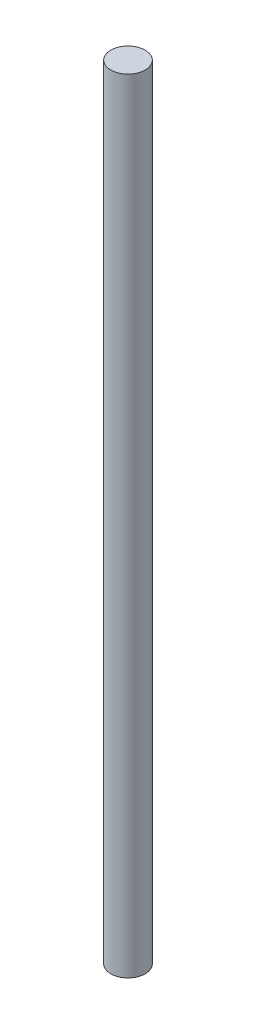
ISO-10303-21;
HEADER;
FILE_DESCRIPTION(('STEP AP214'),'2;1');
FILE_NAME('part.step','',(''),(''),'','','');
FILE_SCHEMA(('AUTOMOTIVE_DESIGN { 1 0 10303 214 1 1 1 1 }'));
ENDSEC;
DATA;
#1=APPLICATION_CONTEXT('core data for automotive mechanical design processes');
#2=APPLICATION_PROTOCOL_DEFINITION('international standard','automotive_design',2000,#1);
#3=PRODUCT_CONTEXT('',#1,'mechanical');
#4=PRODUCT('Part','Part','',(#3));
#5=PRODUCT_RELATED_PRODUCT_CATEGORY('part','',(#4));
#6=PRODUCT_DEFINITION_FORMATION('','',#4);
#7=PRODUCT_DEFINITION_CONTEXT('part definition',#1,'design');
#8=PRODUCT_DEFINITION('design','',#6,#7);
#9=PRODUCT_DEFINITION_SHAPE('','',#8);
#10=(LENGTH_UNIT() NAMED_UNIT(*) SI_UNIT(.MILLI.,.METRE.));
#11=(NAMED_UNIT(*) PLANE_ANGLE_UNIT() SI_UNIT($,.RADIAN.));
#12=(NAMED_UNIT(*) SI_UNIT($,.STERADIAN.) SOLID_ANGLE_UNIT());
#13=UNCERTAINTY_MEASURE_WITH_UNIT(LENGTH_MEASURE(1.E-05),#10,'distance_accuracy_value','');
#14=(GEOMETRIC_REPRESENTATION_CONTEXT(3) GLOBAL_UNCERTAINTY_ASSIGNED_CONTEXT((#13)) GLOBAL_UNIT_ASSIGNED_CONTEXT((#10,
#11,#12)) REPRESENTATION_CONTEXT('',''));
#15=CARTESIAN_POINT('',(0.,0.,0.));
#16=DIRECTION('',(0.,0.,1.));
#17=DIRECTION('',(1.,0.,0.));
#18=AXIS2_PLACEMENT_3D('',#15,#16,#17);
#19=CARTESIAN_POINT('',(-80.3559070687098,300.,-42.454704234635));
#20=DIRECTION('',(0.,-1.,0.));
#21=DIRECTION('',(0.,0.,-1.));
#22=AXIS2_PLACEMENT_3D('',#19,#20,#21);
#23=CYLINDRICAL_SURFACE('',#22,6.6);
#24=CARTESIAN_POINT('',(-80.3559070687098,300.,-42.454704234635));
#25=DIRECTION('',(0.,1.,0.));
#26=DIRECTION('',(0.,0.,1.));
#27=AXIS2_PLACEMENT_3D('',#24,#25,#26);
#28=CIRCLE('',#27,6.6);
#29=CARTESIAN_POINT('',(-80.3559070687098,300.,-35.8547042346351));
#30=VERTEX_POINT('',#29);
#31=EDGE_CURVE('E10',#30,#30,#28,.T.);
#32=ORIENTED_EDGE('',*,*,#31,.F.);
#33=EDGE_LOOP('',(#32));
#34=FACE_BOUND('',#33,.T.);
#35=CARTESIAN_POINT('',(-80.3559070687098,0.,-42.454704234635));
#36=DIRECTION('',(0.,1.,0.));
#37=DIRECTION('',(0.,0.,1.));
#38=AXIS2_PLACEMENT_3D('',#35,#36,#37);
#39=CIRCLE('',#38,6.6);
#40=CARTESIAN_POINT('',(-80.3559070687098,0.,-35.8547042346351));
#41=VERTEX_POINT('',#40);
#42=EDGE_CURVE('E34',#41,#41,#39,.T.);
#43=ORIENTED_EDGE('',*,*,#42,.T.);
#44=EDGE_LOOP('',(#43));
#45=FACE_BOUND('',#44,.T.);
#46=ADVANCED_FACE('F31',(#34,#45),#23,.T.);
#47=CARTESIAN_POINT('',(-80.3559070687098,300.,-42.454704234635));
#48=DIRECTION('',(0.,1.,0.));
#49=DIRECTION('',(0.,0.,1.));
#50=AXIS2_PLACEMENT_3D('',#47,#48,#49);
#51=PLANE('',#50);
#52=ORIENTED_EDGE('',*,*,#31,.T.);
#53=EDGE_LOOP('',(#52));
#54=FACE_BOUND('',#53,.T.);
#55=ADVANCED_FACE('F46',(#54),#51,.T.);
#56=CARTESIAN_POINT('',(-80.3559070687098,0.,-42.454704234635));
#57=DIRECTION('',(0.,1.,0.));
#58=DIRECTION('',(0.,0.,1.));
#59=AXIS2_PLACEMENT_3D('',#56,#57,#58);
#60=PLANE('',#59);
#61=ORIENTED_EDGE('',*,*,#42,.F.);
#62=EDGE_LOOP('',(#61));
#63=FACE_BOUND('',#62,.T.);
#64=ADVANCED_FACE('F44',(#63),#60,.F.);
#65=CLOSED_SHELL('',(#46,#55,#64));
#66=MANIFOLD_SOLID_BREP('B2',#65);
#67=ADVANCED_BREP_SHAPE_REPRESENTATION('',(#18,#66),#14);
#68=SHAPE_DEFINITION_REPRESENTATION(#9,#67);
ENDSEC;
END-ISO-10303-21;
